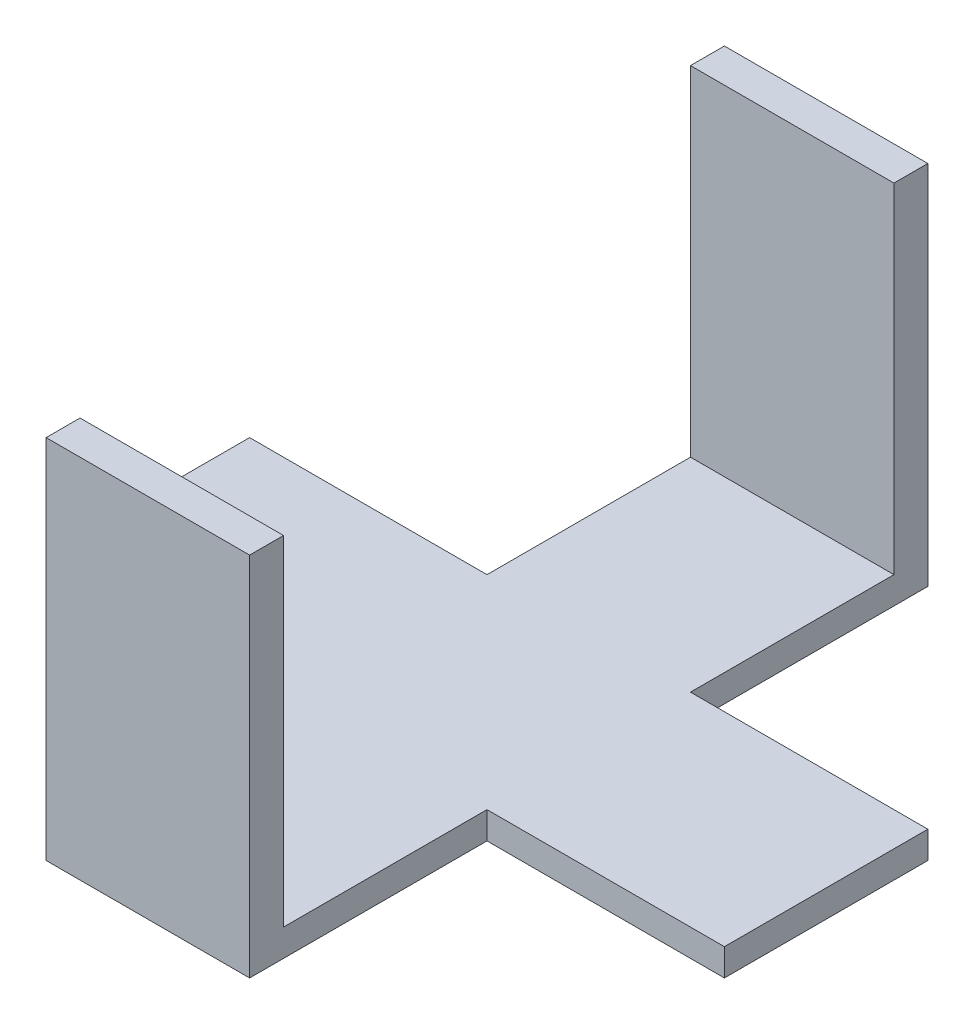
ISO-10303-21;
HEADER;
FILE_DESCRIPTION(('STEP AP214'),'2;1');
FILE_NAME('part.step','',(''),(''),'','','');
FILE_SCHEMA(('AUTOMOTIVE_DESIGN { 1 0 10303 214 1 1 1 1 }'));
ENDSEC;
DATA;
#1=APPLICATION_CONTEXT('core data for automotive mechanical design processes');
#2=APPLICATION_PROTOCOL_DEFINITION('international standard','automotive_design',2000,#1);
#3=PRODUCT_CONTEXT('',#1,'mechanical');
#4=PRODUCT('Part','Part','',(#3));
#5=PRODUCT_RELATED_PRODUCT_CATEGORY('part','',(#4));
#6=PRODUCT_DEFINITION_FORMATION('','',#4);
#7=PRODUCT_DEFINITION_CONTEXT('part definition',#1,'design');
#8=PRODUCT_DEFINITION('design','',#6,#7);
#9=PRODUCT_DEFINITION_SHAPE('','',#8);
#10=(LENGTH_UNIT() NAMED_UNIT(*) SI_UNIT(.MILLI.,.METRE.));
#11=(NAMED_UNIT(*) PLANE_ANGLE_UNIT() SI_UNIT($,.RADIAN.));
#12=(NAMED_UNIT(*) SI_UNIT($,.STERADIAN.) SOLID_ANGLE_UNIT());
#13=UNCERTAINTY_MEASURE_WITH_UNIT(LENGTH_MEASURE(1.E-05),#10,'distance_accuracy_value','');
#14=(GEOMETRIC_REPRESENTATION_CONTEXT(3) GLOBAL_UNCERTAINTY_ASSIGNED_CONTEXT((#13)) GLOBAL_UNIT_ASSIGNED_CONTEXT((#10,
#11,#12)) REPRESENTATION_CONTEXT('',''));
#15=CARTESIAN_POINT('',(0.,0.,0.));
#16=DIRECTION('',(0.,0.,1.));
#17=DIRECTION('',(1.,0.,0.));
#18=AXIS2_PLACEMENT_3D('',#15,#16,#17);
#19=CARTESIAN_POINT('',(0.,4.,0.));
#20=DIRECTION('',(0.,1.,0.));
#21=DIRECTION('',(0.,0.,1.));
#22=AXIS2_PLACEMENT_3D('',#19,#20,#21);
#23=PLANE('',#22);
#24=DIRECTION('',(0.,0.,-1.));
#25=VECTOR('',#24,1.);
#26=CARTESIAN_POINT('',(15.,4.,0.));
#27=LINE('',#26,#25);
#28=CARTESIAN_POINT('',(15.,4.,-15.));
#29=VERTEX_POINT('',#28);
#30=CARTESIAN_POINT('',(15.,4.,-45.));
#31=VERTEX_POINT('',#30);
#32=EDGE_CURVE('E147',#29,#31,#27,.T.);
#33=ORIENTED_EDGE('',*,*,#32,.T.);
#34=DIRECTION('',(1.,0.,0.));
#35=VECTOR('',#34,1.);
#36=CARTESIAN_POINT('',(-15.,4.,-45.));
#37=LINE('',#36,#35);
#38=CARTESIAN_POINT('',(-15.,4.,-45.));
#39=VERTEX_POINT('',#38);
#40=EDGE_CURVE('E241',#39,#31,#37,.T.);
#41=ORIENTED_EDGE('',*,*,#40,.F.);
#42=DIRECTION('',(0.,0.,-1.));
#43=VECTOR('',#42,1.);
#44=CARTESIAN_POINT('',(-15.,4.,0.));
#45=LINE('',#44,#43);
#46=CARTESIAN_POINT('',(-15.,4.,-15.));
#47=VERTEX_POINT('',#46);
#48=EDGE_CURVE('E149',#47,#39,#45,.T.);
#49=ORIENTED_EDGE('',*,*,#48,.F.);
#50=DIRECTION('',(1.,0.,0.));
#51=VECTOR('',#50,1.);
#52=CARTESIAN_POINT('',(0.,4.,-15.));
#53=LINE('',#52,#51);
#54=CARTESIAN_POINT('',(-50.,4.,-15.));
#55=VERTEX_POINT('',#54);
#56=EDGE_CURVE('E184',#55,#47,#53,.T.);
#57=ORIENTED_EDGE('',*,*,#56,.F.);
#58=DIRECTION('',(0.,0.,-1.));
#59=VECTOR('',#58,1.);
#60=CARTESIAN_POINT('',(-50.,4.,0.));
#61=LINE('',#60,#59);
#62=CARTESIAN_POINT('',(-50.,4.,15.));
#63=VERTEX_POINT('',#62);
#64=EDGE_CURVE('E307',#63,#55,#61,.T.);
#65=ORIENTED_EDGE('',*,*,#64,.F.);
#66=DIRECTION('',(1.,0.,0.));
#67=VECTOR('',#66,1.);
#68=CARTESIAN_POINT('',(0.,4.,15.));
#69=LINE('',#68,#67);
#70=CARTESIAN_POINT('',(-15.,4.,15.));
#71=VERTEX_POINT('',#70);
#72=EDGE_CURVE('E207',#63,#71,#69,.T.);
#73=ORIENTED_EDGE('',*,*,#72,.T.);
#74=DIRECTION('',(0.,0.,-1.));
#75=VECTOR('',#74,1.);
#76=CARTESIAN_POINT('',(-15.,4.,0.));
#77=LINE('',#76,#75);
#78=CARTESIAN_POINT('',(-15.,4.,45.));
#79=VERTEX_POINT('',#78);
#80=EDGE_CURVE('E203',#79,#71,#77,.T.);
#81=ORIENTED_EDGE('',*,*,#80,.F.);
#82=DIRECTION('',(-1.,0.,0.));
#83=VECTOR('',#82,1.);
#84=CARTESIAN_POINT('',(-15.,4.,45.));
#85=LINE('',#84,#83);
#86=CARTESIAN_POINT('',(15.,4.,45.));
#87=VERTEX_POINT('',#86);
#88=EDGE_CURVE('E50',#87,#79,#85,.T.);
#89=ORIENTED_EDGE('',*,*,#88,.F.);
#90=DIRECTION('',(0.,0.,-1.));
#91=VECTOR('',#90,1.);
#92=CARTESIAN_POINT('',(15.,4.,0.));
#93=LINE('',#92,#91);
#94=CARTESIAN_POINT('',(15.,4.,15.));
#95=VERTEX_POINT('',#94);
#96=EDGE_CURVE('E206',#87,#95,#93,.T.);
#97=ORIENTED_EDGE('',*,*,#96,.T.);
#98=DIRECTION('',(1.,0.,0.));
#99=VECTOR('',#98,1.);
#100=CARTESIAN_POINT('',(0.,4.,15.));
#101=LINE('',#100,#99);
#102=CARTESIAN_POINT('',(50.,4.,15.));
#103=VERTEX_POINT('',#102);
#104=EDGE_CURVE('E129',#95,#103,#101,.T.);
#105=ORIENTED_EDGE('',*,*,#104,.T.);
#106=DIRECTION('',(0.,0.,-1.));
#107=VECTOR('',#106,1.);
#108=CARTESIAN_POINT('',(50.,4.,0.));
#109=LINE('',#108,#107);
#110=CARTESIAN_POINT('',(50.,4.,-15.));
#111=VERTEX_POINT('',#110);
#112=EDGE_CURVE('E123',#103,#111,#109,.T.);
#113=ORIENTED_EDGE('',*,*,#112,.T.);
#114=DIRECTION('',(1.,0.,0.));
#115=VECTOR('',#114,1.);
#116=CARTESIAN_POINT('',(0.,4.,-15.));
#117=LINE('',#116,#115);
#118=EDGE_CURVE('E127',#29,#111,#117,.T.);
#119=ORIENTED_EDGE('',*,*,#118,.F.);
#120=EDGE_LOOP('',(#33,#41,#49,#57,#65,#73,#81,#89,#97,#105,#113,#119));
#121=FACE_BOUND('',#120,.T.);
#122=ADVANCED_FACE('F33',(#121),#23,.T.);
#123=CARTESIAN_POINT('',(0.,4.,-15.));
#124=DIRECTION('',(0.,0.,-1.));
#125=DIRECTION('',(-1.,0.,0.));
#126=AXIS2_PLACEMENT_3D('',#123,#124,#125);
#127=PLANE('',#126);
#128=DIRECTION('',(1.,0.,0.));
#129=VECTOR('',#128,1.);
#130=CARTESIAN_POINT('',(0.,0.,-15.));
#131=LINE('',#130,#129);
#132=CARTESIAN_POINT('',(-50.,0.,-15.));
#133=VERTEX_POINT('',#132);
#134=CARTESIAN_POINT('',(-15.,0.,-15.));
#135=VERTEX_POINT('',#134);
#136=EDGE_CURVE('E154',#133,#135,#131,.T.);
#137=ORIENTED_EDGE('',*,*,#136,.F.);
#138=DIRECTION('',(0.,-1.,0.));
#139=VECTOR('',#138,1.);
#140=CARTESIAN_POINT('',(-50.,4.,-15.));
#141=LINE('',#140,#139);
#142=EDGE_CURVE('E11',#55,#133,#141,.T.);
#143=ORIENTED_EDGE('',*,*,#142,.F.);
#144=ORIENTED_EDGE('',*,*,#56,.T.);
#145=DIRECTION('',(0.,-1.,0.));
#146=VECTOR('',#145,1.);
#147=CARTESIAN_POINT('',(-15.,4.,-15.));
#148=LINE('',#147,#146);
#149=EDGE_CURVE('E59',#47,#135,#148,.T.);
#150=ORIENTED_EDGE('',*,*,#149,.T.);
#151=EDGE_LOOP('',(#137,#143,#144,#150));
#152=FACE_BOUND('',#151,.T.);
#153=ADVANCED_FACE('F35',(#152),#127,.T.);
#154=CARTESIAN_POINT('',(-50.,4.,0.));
#155=DIRECTION('',(-1.,0.,0.));
#156=DIRECTION('',(0.,0.,1.));
#157=AXIS2_PLACEMENT_3D('',#154,#155,#156);
#158=PLANE('',#157);
#159=DIRECTION('',(0.,0.,-1.));
#160=VECTOR('',#159,1.);
#161=CARTESIAN_POINT('',(-50.,0.,0.));
#162=LINE('',#161,#160);
#163=CARTESIAN_POINT('',(-50.,0.,15.));
#164=VERTEX_POINT('',#163);
#165=EDGE_CURVE('E156',#164,#133,#162,.T.);
#166=ORIENTED_EDGE('',*,*,#165,.F.);
#167=DIRECTION('',(0.,-1.,0.));
#168=VECTOR('',#167,1.);
#169=CARTESIAN_POINT('',(-50.,4.,15.));
#170=LINE('',#169,#168);
#171=EDGE_CURVE('E42',#63,#164,#170,.T.);
#172=ORIENTED_EDGE('',*,*,#171,.F.);
#173=ORIENTED_EDGE('',*,*,#64,.T.);
#174=ORIENTED_EDGE('',*,*,#142,.T.);
#175=EDGE_LOOP('',(#166,#172,#173,#174));
#176=FACE_BOUND('',#175,.T.);
#177=ADVANCED_FACE('F304',(#176),#158,.T.);
#178=CARTESIAN_POINT('',(0.,4.,15.));
#179=DIRECTION('',(0.,0.,-1.));
#180=DIRECTION('',(-1.,0.,0.));
#181=AXIS2_PLACEMENT_3D('',#178,#179,#180);
#182=PLANE('',#181);
#183=DIRECTION('',(1.,0.,0.));
#184=VECTOR('',#183,1.);
#185=CARTESIAN_POINT('',(0.,0.,15.));
#186=LINE('',#185,#184);
#187=CARTESIAN_POINT('',(-15.,0.,15.));
#188=VERTEX_POINT('',#187);
#189=EDGE_CURVE('E160',#164,#188,#186,.T.);
#190=ORIENTED_EDGE('',*,*,#189,.T.);
#191=DIRECTION('',(0.,-1.,0.));
#192=VECTOR('',#191,1.);
#193=CARTESIAN_POINT('',(-15.,4.,15.));
#194=LINE('',#193,#192);
#195=EDGE_CURVE('E200',#71,#188,#194,.T.);
#196=ORIENTED_EDGE('',*,*,#195,.F.);
#197=ORIENTED_EDGE('',*,*,#72,.F.);
#198=ORIENTED_EDGE('',*,*,#171,.T.);
#199=EDGE_LOOP('',(#190,#196,#197,#198));
#200=FACE_BOUND('',#199,.T.);
#201=ADVANCED_FACE('F301',(#200),#182,.F.);
#202=CARTESIAN_POINT('',(-15.,4.,0.));
#203=DIRECTION('',(-1.,0.,0.));
#204=DIRECTION('',(0.,0.,1.));
#205=AXIS2_PLACEMENT_3D('',#202,#203,#204);
#206=PLANE('',#205);
#207=DIRECTION('',(0.,0.,-1.));
#208=VECTOR('',#207,1.);
#209=CARTESIAN_POINT('',(-15.,0.,0.));
#210=LINE('',#209,#208);
#211=CARTESIAN_POINT('',(-15.,0.,50.));
#212=VERTEX_POINT('',#211);
#213=EDGE_CURVE('E163',#212,#188,#210,.T.);
#214=ORIENTED_EDGE('',*,*,#213,.F.);
#215=DIRECTION('',(0.,-1.,0.));
#216=VECTOR('',#215,1.);
#217=CARTESIAN_POINT('',(-15.,4.,50.));
#218=LINE('',#217,#216);
#219=CARTESIAN_POINT('',(-15.,54.,50.));
#220=VERTEX_POINT('',#219);
#221=EDGE_CURVE('E198',#220,#212,#218,.T.);
#222=ORIENTED_EDGE('',*,*,#221,.F.);
#223=DIRECTION('',(0.,0.,1.));
#224=VECTOR('',#223,1.);
#225=CARTESIAN_POINT('',(-15.,54.,50.));
#226=LINE('',#225,#224);
#227=CARTESIAN_POINT('',(-15.,54.,45.));
#228=VERTEX_POINT('',#227);
#229=EDGE_CURVE('E269',#228,#220,#226,.T.);
#230=ORIENTED_EDGE('',*,*,#229,.F.);
#231=DIRECTION('',(0.,-1.,0.));
#232=VECTOR('',#231,1.);
#233=CARTESIAN_POINT('',(-15.,54.,45.));
#234=LINE('',#233,#232);
#235=EDGE_CURVE('E273',#228,#79,#234,.T.);
#236=ORIENTED_EDGE('',*,*,#235,.T.);
#237=ORIENTED_EDGE('',*,*,#80,.T.);
#238=ORIENTED_EDGE('',*,*,#195,.T.);
#239=EDGE_LOOP('',(#214,#222,#230,#236,#237,#238));
#240=FACE_BOUND('',#239,.T.);
#241=ADVANCED_FACE('F280',(#240),#206,.T.);
#242=CARTESIAN_POINT('',(0.,4.,50.));
#243=DIRECTION('',(0.,0.,-1.));
#244=DIRECTION('',(-1.,0.,0.));
#245=AXIS2_PLACEMENT_3D('',#242,#243,#244);
#246=PLANE('',#245);
#247=DIRECTION('',(1.,0.,0.));
#248=VECTOR('',#247,1.);
#249=CARTESIAN_POINT('',(0.,0.,50.));
#250=LINE('',#249,#248);
#251=CARTESIAN_POINT('',(15.,0.,50.));
#252=VERTEX_POINT('',#251);
#253=EDGE_CURVE('E166',#212,#252,#250,.T.);
#254=ORIENTED_EDGE('',*,*,#253,.T.);
#255=DIRECTION('',(0.,-1.,0.));
#256=VECTOR('',#255,1.);
#257=CARTESIAN_POINT('',(15.,4.,50.));
#258=LINE('',#257,#256);
#259=CARTESIAN_POINT('',(15.,54.,50.));
#260=VERTEX_POINT('',#259);
#261=EDGE_CURVE('E195',#260,#252,#258,.T.);
#262=ORIENTED_EDGE('',*,*,#261,.F.);
#263=DIRECTION('',(1.,0.,0.));
#264=VECTOR('',#263,1.);
#265=CARTESIAN_POINT('',(-15.,54.,50.));
#266=LINE('',#265,#264);
#267=EDGE_CURVE('E282',#220,#260,#266,.T.);
#268=ORIENTED_EDGE('',*,*,#267,.F.);
#269=ORIENTED_EDGE('',*,*,#221,.T.);
#270=EDGE_LOOP('',(#254,#262,#268,#269));
#271=FACE_BOUND('',#270,.T.);
#272=ADVANCED_FACE('F364',(#271),#246,.F.);
#273=CARTESIAN_POINT('',(15.,4.,0.));
#274=DIRECTION('',(-1.,0.,0.));
#275=DIRECTION('',(0.,0.,1.));
#276=AXIS2_PLACEMENT_3D('',#273,#274,#275);
#277=PLANE('',#276);
#278=DIRECTION('',(0.,0.,-1.));
#279=VECTOR('',#278,1.);
#280=CARTESIAN_POINT('',(15.,0.,0.));
#281=LINE('',#280,#279);
#282=CARTESIAN_POINT('',(15.,0.,15.));
#283=VERTEX_POINT('',#282);
#284=EDGE_CURVE('E168',#252,#283,#281,.T.);
#285=ORIENTED_EDGE('',*,*,#284,.T.);
#286=DIRECTION('',(0.,-1.,0.));
#287=VECTOR('',#286,1.);
#288=CARTESIAN_POINT('',(15.,4.,15.));
#289=LINE('',#288,#287);
#290=EDGE_CURVE('E192',#95,#283,#289,.T.);
#291=ORIENTED_EDGE('',*,*,#290,.F.);
#292=ORIENTED_EDGE('',*,*,#96,.F.);
#293=DIRECTION('',(0.,-1.,0.));
#294=VECTOR('',#293,1.);
#295=CARTESIAN_POINT('',(15.,54.,45.));
#296=LINE('',#295,#294);
#297=CARTESIAN_POINT('',(15.,54.,45.));
#298=VERTEX_POINT('',#297);
#299=EDGE_CURVE('E157',#298,#87,#296,.T.);
#300=ORIENTED_EDGE('',*,*,#299,.F.);
#301=DIRECTION('',(0.,0.,-1.));
#302=VECTOR('',#301,1.);
#303=CARTESIAN_POINT('',(15.,54.,50.));
#304=LINE('',#303,#302);
#305=EDGE_CURVE('E271',#260,#298,#304,.T.);
#306=ORIENTED_EDGE('',*,*,#305,.F.);
#307=ORIENTED_EDGE('',*,*,#261,.T.);
#308=EDGE_LOOP('',(#285,#291,#292,#300,#306,#307));
#309=FACE_BOUND('',#308,.T.);
#310=ADVANCED_FACE('F218',(#309),#277,.F.);
#311=CARTESIAN_POINT('',(0.,4.,15.));
#312=DIRECTION('',(0.,0.,-1.));
#313=DIRECTION('',(-1.,0.,0.));
#314=AXIS2_PLACEMENT_3D('',#311,#312,#313);
#315=PLANE('',#314);
#316=DIRECTION('',(1.,0.,0.));
#317=VECTOR('',#316,1.);
#318=CARTESIAN_POINT('',(0.,0.,15.));
#319=LINE('',#318,#317);
#320=CARTESIAN_POINT('',(50.,0.,15.));
#321=VERTEX_POINT('',#320);
#322=EDGE_CURVE('E170',#283,#321,#319,.T.);
#323=ORIENTED_EDGE('',*,*,#322,.T.);
#324=DIRECTION('',(0.,-1.,0.));
#325=VECTOR('',#324,1.);
#326=CARTESIAN_POINT('',(50.,4.,15.));
#327=LINE('',#326,#325);
#328=EDGE_CURVE('E142',#103,#321,#327,.T.);
#329=ORIENTED_EDGE('',*,*,#328,.F.);
#330=ORIENTED_EDGE('',*,*,#104,.F.);
#331=ORIENTED_EDGE('',*,*,#290,.T.);
#332=EDGE_LOOP('',(#323,#329,#330,#331));
#333=FACE_BOUND('',#332,.T.);
#334=ADVANCED_FACE('F222',(#333),#315,.F.);
#335=CARTESIAN_POINT('',(50.,4.,0.));
#336=DIRECTION('',(-1.,0.,0.));
#337=DIRECTION('',(0.,0.,1.));
#338=AXIS2_PLACEMENT_3D('',#335,#336,#337);
#339=PLANE('',#338);
#340=DIRECTION('',(0.,0.,-1.));
#341=VECTOR('',#340,1.);
#342=CARTESIAN_POINT('',(50.,0.,0.));
#343=LINE('',#342,#341);
#344=CARTESIAN_POINT('',(50.,0.,-15.));
#345=VERTEX_POINT('',#344);
#346=EDGE_CURVE('E138',#321,#345,#343,.T.);
#347=ORIENTED_EDGE('',*,*,#346,.T.);
#348=DIRECTION('',(0.,-1.,0.));
#349=VECTOR('',#348,1.);
#350=CARTESIAN_POINT('',(50.,4.,-15.));
#351=LINE('',#350,#349);
#352=EDGE_CURVE('E135',#111,#345,#351,.T.);
#353=ORIENTED_EDGE('',*,*,#352,.F.);
#354=ORIENTED_EDGE('',*,*,#112,.F.);
#355=ORIENTED_EDGE('',*,*,#328,.T.);
#356=EDGE_LOOP('',(#347,#353,#354,#355));
#357=FACE_BOUND('',#356,.T.);
#358=ADVANCED_FACE('F136',(#357),#339,.F.);
#359=CARTESIAN_POINT('',(0.,4.,-15.));
#360=DIRECTION('',(0.,0.,-1.));
#361=DIRECTION('',(-1.,0.,0.));
#362=AXIS2_PLACEMENT_3D('',#359,#360,#361);
#363=PLANE('',#362);
#364=DIRECTION('',(1.,0.,0.));
#365=VECTOR('',#364,1.);
#366=CARTESIAN_POINT('',(0.,0.,-15.));
#367=LINE('',#366,#365);
#368=CARTESIAN_POINT('',(15.,0.,-15.));
#369=VERTEX_POINT('',#368);
#370=EDGE_CURVE('E173',#369,#345,#367,.T.);
#371=ORIENTED_EDGE('',*,*,#370,.F.);
#372=DIRECTION('',(0.,-1.,0.));
#373=VECTOR('',#372,1.);
#374=CARTESIAN_POINT('',(15.,4.,-15.));
#375=LINE('',#374,#373);
#376=EDGE_CURVE('E143',#29,#369,#375,.T.);
#377=ORIENTED_EDGE('',*,*,#376,.F.);
#378=ORIENTED_EDGE('',*,*,#118,.T.);
#379=ORIENTED_EDGE('',*,*,#352,.T.);
#380=EDGE_LOOP('',(#371,#377,#378,#379));
#381=FACE_BOUND('',#380,.T.);
#382=ADVANCED_FACE('F145',(#381),#363,.T.);
#383=CARTESIAN_POINT('',(15.,4.,0.));
#384=DIRECTION('',(-1.,0.,0.));
#385=DIRECTION('',(0.,0.,1.));
#386=AXIS2_PLACEMENT_3D('',#383,#384,#385);
#387=PLANE('',#386);
#388=DIRECTION('',(0.,0.,-1.));
#389=VECTOR('',#388,1.);
#390=CARTESIAN_POINT('',(15.,0.,0.));
#391=LINE('',#390,#389);
#392=CARTESIAN_POINT('',(15.,0.,-50.));
#393=VERTEX_POINT('',#392);
#394=EDGE_CURVE('E175',#369,#393,#391,.T.);
#395=ORIENTED_EDGE('',*,*,#394,.T.);
#396=DIRECTION('',(0.,-1.,0.));
#397=VECTOR('',#396,1.);
#398=CARTESIAN_POINT('',(15.,4.,-50.));
#399=LINE('',#398,#397);
#400=CARTESIAN_POINT('',(15.,54.,-50.));
#401=VERTEX_POINT('',#400);
#402=EDGE_CURVE('E188',#401,#393,#399,.T.);
#403=ORIENTED_EDGE('',*,*,#402,.F.);
#404=DIRECTION('',(0.,0.,-1.));
#405=VECTOR('',#404,1.);
#406=CARTESIAN_POINT('',(15.,54.,-50.));
#407=LINE('',#406,#405);
#408=CARTESIAN_POINT('',(15.,54.,-45.));
#409=VERTEX_POINT('',#408);
#410=EDGE_CURVE('E322',#409,#401,#407,.T.);
#411=ORIENTED_EDGE('',*,*,#410,.F.);
#412=DIRECTION('',(0.,-1.,0.));
#413=VECTOR('',#412,1.);
#414=CARTESIAN_POINT('',(15.,54.,-45.));
#415=LINE('',#414,#413);
#416=EDGE_CURVE('E236',#409,#31,#415,.T.);
#417=ORIENTED_EDGE('',*,*,#416,.T.);
#418=ORIENTED_EDGE('',*,*,#32,.F.);
#419=ORIENTED_EDGE('',*,*,#376,.T.);
#420=EDGE_LOOP('',(#395,#403,#411,#417,#418,#419));
#421=FACE_BOUND('',#420,.T.);
#422=ADVANCED_FACE('F229',(#421),#387,.F.);
#423=CARTESIAN_POINT('',(0.,4.,-50.));
#424=DIRECTION('',(0.,0.,-1.));
#425=DIRECTION('',(-1.,0.,0.));
#426=AXIS2_PLACEMENT_3D('',#423,#424,#425);
#427=PLANE('',#426);
#428=DIRECTION('',(1.,0.,0.));
#429=VECTOR('',#428,1.);
#430=CARTESIAN_POINT('',(0.,0.,-50.));
#431=LINE('',#430,#429);
#432=CARTESIAN_POINT('',(-15.,0.,-50.));
#433=VERTEX_POINT('',#432);
#434=EDGE_CURVE('E178',#433,#393,#431,.T.);
#435=ORIENTED_EDGE('',*,*,#434,.F.);
#436=DIRECTION('',(0.,-1.,0.));
#437=VECTOR('',#436,1.);
#438=CARTESIAN_POINT('',(-15.,4.,-50.));
#439=LINE('',#438,#437);
#440=CARTESIAN_POINT('',(-15.,54.,-50.));
#441=VERTEX_POINT('',#440);
#442=EDGE_CURVE('E186',#441,#433,#439,.T.);
#443=ORIENTED_EDGE('',*,*,#442,.F.);
#444=DIRECTION('',(-1.,0.,0.));
#445=VECTOR('',#444,1.);
#446=CARTESIAN_POINT('',(-15.,54.,-50.));
#447=LINE('',#446,#445);
#448=EDGE_CURVE('E319',#401,#441,#447,.T.);
#449=ORIENTED_EDGE('',*,*,#448,.F.);
#450=ORIENTED_EDGE('',*,*,#402,.T.);
#451=EDGE_LOOP('',(#435,#443,#449,#450));
#452=FACE_BOUND('',#451,.T.);
#453=ADVANCED_FACE('F318',(#452),#427,.T.);
#454=CARTESIAN_POINT('',(-15.,4.,0.));
#455=DIRECTION('',(-1.,0.,0.));
#456=DIRECTION('',(0.,0.,1.));
#457=AXIS2_PLACEMENT_3D('',#454,#455,#456);
#458=PLANE('',#457);
#459=DIRECTION('',(0.,0.,-1.));
#460=VECTOR('',#459,1.);
#461=CARTESIAN_POINT('',(-15.,0.,0.));
#462=LINE('',#461,#460);
#463=EDGE_CURVE('E181',#135,#433,#462,.T.);
#464=ORIENTED_EDGE('',*,*,#463,.F.);
#465=ORIENTED_EDGE('',*,*,#149,.F.);
#466=ORIENTED_EDGE('',*,*,#48,.T.);
#467=DIRECTION('',(0.,-1.,0.));
#468=VECTOR('',#467,1.);
#469=CARTESIAN_POINT('',(-15.,54.,-45.));
#470=LINE('',#469,#468);
#471=CARTESIAN_POINT('',(-15.,54.,-45.));
#472=VERTEX_POINT('',#471);
#473=EDGE_CURVE('E285',#472,#39,#470,.T.);
#474=ORIENTED_EDGE('',*,*,#473,.F.);
#475=DIRECTION('',(0.,0.,1.));
#476=VECTOR('',#475,1.);
#477=CARTESIAN_POINT('',(-15.,54.,-50.));
#478=LINE('',#477,#476);
#479=EDGE_CURVE('E314',#441,#472,#478,.T.);
#480=ORIENTED_EDGE('',*,*,#479,.F.);
#481=ORIENTED_EDGE('',*,*,#442,.T.);
#482=EDGE_LOOP('',(#464,#465,#466,#474,#480,#481));
#483=FACE_BOUND('',#482,.T.);
#484=ADVANCED_FACE('F308',(#483),#458,.T.);
#485=CARTESIAN_POINT('',(0.,0.,0.));
#486=DIRECTION('',(0.,1.,0.));
#487=DIRECTION('',(0.,0.,1.));
#488=AXIS2_PLACEMENT_3D('',#485,#486,#487);
#489=PLANE('',#488);
#490=ORIENTED_EDGE('',*,*,#136,.T.);
#491=ORIENTED_EDGE('',*,*,#463,.T.);
#492=ORIENTED_EDGE('',*,*,#434,.T.);
#493=ORIENTED_EDGE('',*,*,#394,.F.);
#494=ORIENTED_EDGE('',*,*,#370,.T.);
#495=ORIENTED_EDGE('',*,*,#346,.F.);
#496=ORIENTED_EDGE('',*,*,#322,.F.);
#497=ORIENTED_EDGE('',*,*,#284,.F.);
#498=ORIENTED_EDGE('',*,*,#253,.F.);
#499=ORIENTED_EDGE('',*,*,#213,.T.);
#500=ORIENTED_EDGE('',*,*,#189,.F.);
#501=ORIENTED_EDGE('',*,*,#165,.T.);
#502=EDGE_LOOP('',(#490,#491,#492,#493,#494,#495,#496,#497,#498,#499,#500,#501));
#503=FACE_BOUND('',#502,.T.);
#504=ADVANCED_FACE('F224',(#503),#489,.F.);
#505=CARTESIAN_POINT('',(-15.,54.,45.));
#506=DIRECTION('',(0.,0.,1.));
#507=DIRECTION('',(1.,0.,0.));
#508=AXIS2_PLACEMENT_3D('',#505,#506,#507);
#509=PLANE('',#508);
#510=ORIENTED_EDGE('',*,*,#88,.T.);
#511=ORIENTED_EDGE('',*,*,#235,.F.);
#512=DIRECTION('',(-1.,0.,0.));
#513=VECTOR('',#512,1.);
#514=CARTESIAN_POINT('',(-15.,54.,45.));
#515=LINE('',#514,#513);
#516=EDGE_CURVE('E264',#298,#228,#515,.T.);
#517=ORIENTED_EDGE('',*,*,#516,.F.);
#518=ORIENTED_EDGE('',*,*,#299,.T.);
#519=EDGE_LOOP('',(#510,#511,#517,#518));
#520=FACE_BOUND('',#519,.T.);
#521=ADVANCED_FACE('F276',(#520),#509,.F.);
#522=CARTESIAN_POINT('',(0.,54.,0.));
#523=DIRECTION('',(0.,-1.,0.));
#524=DIRECTION('',(0.,0.,-1.));
#525=AXIS2_PLACEMENT_3D('',#522,#523,#524);
#526=PLANE('',#525);
#527=ORIENTED_EDGE('',*,*,#229,.T.);
#528=ORIENTED_EDGE('',*,*,#267,.T.);
#529=ORIENTED_EDGE('',*,*,#305,.T.);
#530=ORIENTED_EDGE('',*,*,#516,.T.);
#531=EDGE_LOOP('',(#527,#528,#529,#530));
#532=FACE_BOUND('',#531,.T.);
#533=ADVANCED_FACE('F266',(#532),#526,.F.);
#534=CARTESIAN_POINT('',(-15.,54.,-45.));
#535=DIRECTION('',(0.,0.,-1.));
#536=DIRECTION('',(-1.,0.,0.));
#537=AXIS2_PLACEMENT_3D('',#534,#535,#536);
#538=PLANE('',#537);
#539=ORIENTED_EDGE('',*,*,#40,.T.);
#540=ORIENTED_EDGE('',*,*,#416,.F.);
#541=DIRECTION('',(1.,0.,0.));
#542=VECTOR('',#541,1.);
#543=CARTESIAN_POINT('',(-15.,54.,-45.));
#544=LINE('',#543,#542);
#545=EDGE_CURVE('E324',#472,#409,#544,.T.);
#546=ORIENTED_EDGE('',*,*,#545,.F.);
#547=ORIENTED_EDGE('',*,*,#473,.T.);
#548=EDGE_LOOP('',(#539,#540,#546,#547));
#549=FACE_BOUND('',#548,.T.);
#550=ADVANCED_FACE('F332',(#549),#538,.F.);
#551=CARTESIAN_POINT('',(0.,54.,0.));
#552=DIRECTION('',(0.,1.,0.));
#553=DIRECTION('',(0.,0.,1.));
#554=AXIS2_PLACEMENT_3D('',#551,#552,#553);
#555=PLANE('',#554);
#556=ORIENTED_EDGE('',*,*,#479,.T.);
#557=ORIENTED_EDGE('',*,*,#545,.T.);
#558=ORIENTED_EDGE('',*,*,#410,.T.);
#559=ORIENTED_EDGE('',*,*,#448,.T.);
#560=EDGE_LOOP('',(#556,#557,#558,#559));
#561=FACE_BOUND('',#560,.T.);
#562=ADVANCED_FACE('F330',(#561),#555,.T.);
#563=CLOSED_SHELL('',(#122,#153,#177,#201,#241,#272,#310,#334,#358,#382,#422,#453,#484,#504,
#521,#533,#550,#562));
#564=MANIFOLD_SOLID_BREP('B2',#563);
#565=ADVANCED_BREP_SHAPE_REPRESENTATION('',(#18,#564),#14);
#566=SHAPE_DEFINITION_REPRESENTATION(#9,#565);
ENDSEC;
END-ISO-10303-21;
